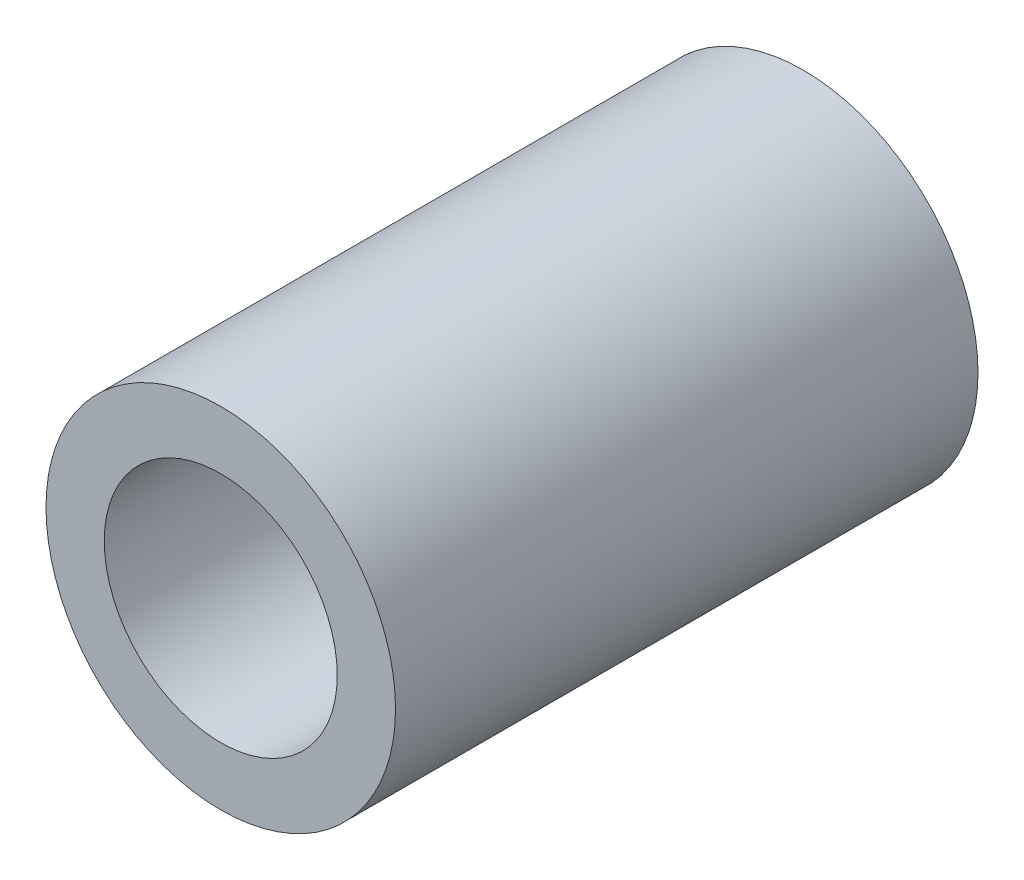
ISO-10303-21;
HEADER;
FILE_DESCRIPTION(('STEP AP214'),'2;1');
FILE_NAME('part.step','',(''),(''),'','','');
FILE_SCHEMA(('AUTOMOTIVE_DESIGN { 1 0 10303 214 1 1 1 1 }'));
ENDSEC;
DATA;
#1=APPLICATION_CONTEXT('core data for automotive mechanical design processes');
#2=APPLICATION_PROTOCOL_DEFINITION('international standard','automotive_design',2000,#1);
#3=PRODUCT_CONTEXT('',#1,'mechanical');
#4=PRODUCT('Part','Part','',(#3));
#5=PRODUCT_RELATED_PRODUCT_CATEGORY('part','',(#4));
#6=PRODUCT_DEFINITION_FORMATION('','',#4);
#7=PRODUCT_DEFINITION_CONTEXT('part definition',#1,'design');
#8=PRODUCT_DEFINITION('design','',#6,#7);
#9=PRODUCT_DEFINITION_SHAPE('','',#8);
#10=(LENGTH_UNIT() NAMED_UNIT(*) SI_UNIT(.MILLI.,.METRE.));
#11=(NAMED_UNIT(*) PLANE_ANGLE_UNIT() SI_UNIT($,.RADIAN.));
#12=(NAMED_UNIT(*) SI_UNIT($,.STERADIAN.) SOLID_ANGLE_UNIT());
#13=UNCERTAINTY_MEASURE_WITH_UNIT(LENGTH_MEASURE(1.E-05),#10,'distance_accuracy_value','');
#14=(GEOMETRIC_REPRESENTATION_CONTEXT(3) GLOBAL_UNCERTAINTY_ASSIGNED_CONTEXT((#13)) GLOBAL_UNIT_ASSIGNED_CONTEXT((#10,
#11,#12)) REPRESENTATION_CONTEXT('',''));
#15=CARTESIAN_POINT('',(0.,0.,0.));
#16=DIRECTION('',(0.,0.,1.));
#17=DIRECTION('',(1.,0.,0.));
#18=AXIS2_PLACEMENT_3D('',#15,#16,#17);
#19=CARTESIAN_POINT('',(0.,0.,10.));
#20=DIRECTION('',(0.,0.,1.));
#21=DIRECTION('',(1.,0.,0.));
#22=AXIS2_PLACEMENT_3D('',#19,#20,#21);
#23=PLANE('',#22);
#24=CARTESIAN_POINT('',(0.,0.,10.));
#25=DIRECTION('',(0.,0.,1.));
#26=DIRECTION('',(1.,0.,0.));
#27=AXIS2_PLACEMENT_3D('',#24,#25,#26);
#28=CIRCLE('',#27,3.);
#29=CARTESIAN_POINT('',(3.,0.,10.));
#30=VERTEX_POINT('',#29);
#31=EDGE_CURVE('E10',#30,#30,#28,.T.);
#32=ORIENTED_EDGE('',*,*,#31,.T.);
#33=EDGE_LOOP('',(#32));
#34=FACE_BOUND('',#33,.T.);
#35=CARTESIAN_POINT('',(0.,0.,10.));
#36=DIRECTION('',(0.,0.,1.));
#37=DIRECTION('',(1.,0.,0.));
#38=AXIS2_PLACEMENT_3D('',#35,#36,#37);
#39=CIRCLE('',#38,2.);
#40=CARTESIAN_POINT('',(2.,0.,10.));
#41=VERTEX_POINT('',#40);
#42=EDGE_CURVE('E42',#41,#41,#39,.T.);
#43=ORIENTED_EDGE('',*,*,#42,.F.);
#44=EDGE_LOOP('',(#43));
#45=FACE_BOUND('',#44,.T.);
#46=ADVANCED_FACE('F31',(#34,#45),#23,.T.);
#47=CARTESIAN_POINT('',(0.,0.,0.));
#48=DIRECTION('',(0.,0.,1.));
#49=DIRECTION('',(1.,0.,0.));
#50=AXIS2_PLACEMENT_3D('',#47,#48,#49);
#51=PLANE('',#50);
#52=CARTESIAN_POINT('',(0.,0.,0.));
#53=DIRECTION('',(0.,0.,1.));
#54=DIRECTION('',(1.,0.,0.));
#55=AXIS2_PLACEMENT_3D('',#52,#53,#54);
#56=CIRCLE('',#55,3.);
#57=CARTESIAN_POINT('',(3.,0.,0.));
#58=VERTEX_POINT('',#57);
#59=EDGE_CURVE('E35',#58,#58,#56,.T.);
#60=ORIENTED_EDGE('',*,*,#59,.F.);
#61=EDGE_LOOP('',(#60));
#62=FACE_BOUND('',#61,.T.);
#63=CARTESIAN_POINT('',(0.,0.,0.));
#64=DIRECTION('',(0.,0.,1.));
#65=DIRECTION('',(1.,0.,0.));
#66=AXIS2_PLACEMENT_3D('',#63,#64,#65);
#67=CIRCLE('',#66,2.);
#68=CARTESIAN_POINT('',(2.,0.,0.));
#69=VERTEX_POINT('',#68);
#70=EDGE_CURVE('E44',#69,#69,#67,.T.);
#71=ORIENTED_EDGE('',*,*,#70,.T.);
#72=EDGE_LOOP('',(#71));
#73=FACE_BOUND('',#72,.T.);
#74=ADVANCED_FACE('F54',(#62,#73),#51,.F.);
#75=CARTESIAN_POINT('',(0.,0.,10.));
#76=DIRECTION('',(0.,0.,-1.));
#77=DIRECTION('',(-1.,0.,0.));
#78=AXIS2_PLACEMENT_3D('',#75,#76,#77);
#79=CYLINDRICAL_SURFACE('',#78,3.);
#80=ORIENTED_EDGE('',*,*,#31,.F.);
#81=EDGE_LOOP('',(#80));
#82=FACE_BOUND('',#81,.T.);
#83=ORIENTED_EDGE('',*,*,#59,.T.);
#84=EDGE_LOOP('',(#83));
#85=FACE_BOUND('',#84,.T.);
#86=ADVANCED_FACE('F33',(#82,#85),#79,.T.);
#87=CARTESIAN_POINT('',(0.,0.,10.));
#88=DIRECTION('',(0.,0.,-1.));
#89=DIRECTION('',(-1.,0.,0.));
#90=AXIS2_PLACEMENT_3D('',#87,#88,#89);
#91=CYLINDRICAL_SURFACE('',#90,2.);
#92=ORIENTED_EDGE('',*,*,#42,.T.);
#93=EDGE_LOOP('',(#92));
#94=FACE_BOUND('',#93,.T.);
#95=ORIENTED_EDGE('',*,*,#70,.F.);
#96=EDGE_LOOP('',(#95));
#97=FACE_BOUND('',#96,.T.);
#98=ADVANCED_FACE('F50',(#94,#97),#91,.F.);
#99=CLOSED_SHELL('',(#46,#74,#86,#98));
#100=MANIFOLD_SOLID_BREP('B2',#99);
#101=ADVANCED_BREP_SHAPE_REPRESENTATION('',(#18,#100),#14);
#102=SHAPE_DEFINITION_REPRESENTATION(#9,#101);
ENDSEC;
END-ISO-10303-21;
